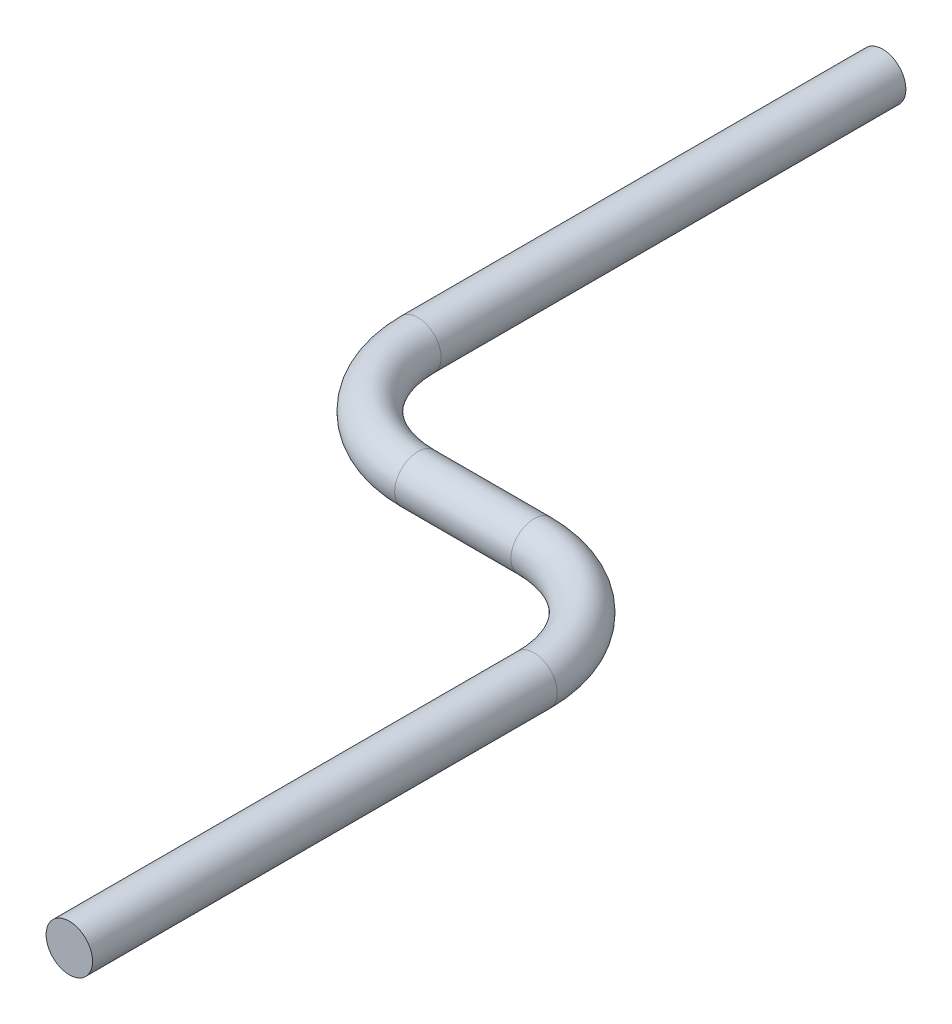
ISO-10303-21;
HEADER;
FILE_DESCRIPTION(('STEP AP214'),'2;1');
FILE_NAME('part.step','',(''),(''),'','','');
FILE_SCHEMA(('AUTOMOTIVE_DESIGN { 1 0 10303 214 1 1 1 1 }'));
ENDSEC;
DATA;
#1=APPLICATION_CONTEXT('core data for automotive mechanical design processes');
#2=APPLICATION_PROTOCOL_DEFINITION('international standard','automotive_design',2000,#1);
#3=PRODUCT_CONTEXT('',#1,'mechanical');
#4=PRODUCT('Part','Part','',(#3));
#5=PRODUCT_RELATED_PRODUCT_CATEGORY('part','',(#4));
#6=PRODUCT_DEFINITION_FORMATION('','',#4);
#7=PRODUCT_DEFINITION_CONTEXT('part definition',#1,'design');
#8=PRODUCT_DEFINITION('design','',#6,#7);
#9=PRODUCT_DEFINITION_SHAPE('','',#8);
#10=(LENGTH_UNIT() NAMED_UNIT(*) SI_UNIT(.MILLI.,.METRE.));
#11=(NAMED_UNIT(*) PLANE_ANGLE_UNIT() SI_UNIT($,.RADIAN.));
#12=(NAMED_UNIT(*) SI_UNIT($,.STERADIAN.) SOLID_ANGLE_UNIT());
#13=UNCERTAINTY_MEASURE_WITH_UNIT(LENGTH_MEASURE(1.E-05),#10,'distance_accuracy_value','');
#14=(GEOMETRIC_REPRESENTATION_CONTEXT(3) GLOBAL_UNCERTAINTY_ASSIGNED_CONTEXT((#13)) GLOBAL_UNIT_ASSIGNED_CONTEXT((#10,
#11,#12)) REPRESENTATION_CONTEXT('',''));
#15=CARTESIAN_POINT('',(0.,0.,0.));
#16=DIRECTION('',(0.,0.,1.));
#17=DIRECTION('',(1.,0.,0.));
#18=AXIS2_PLACEMENT_3D('',#15,#16,#17);
#19=CARTESIAN_POINT('',(0.,0.,0.));
#20=DIRECTION('',(0.,0.,1.));
#21=DIRECTION('',(1.,0.,0.));
#22=AXIS2_PLACEMENT_3D('',#19,#20,#21);
#23=PLANE('',#22);
#24=CARTESIAN_POINT('',(0.,0.,0.));
#25=DIRECTION('',(0.,0.,1.));
#26=DIRECTION('',(1.,0.,0.));
#27=AXIS2_PLACEMENT_3D('',#24,#25,#26);
#28=CIRCLE('',#27,2.);
#29=CARTESIAN_POINT('',(2.,0.,0.));
#30=VERTEX_POINT('',#29);
#31=EDGE_CURVE('E57',#30,#30,#28,.T.);
#32=ORIENTED_EDGE('',*,*,#31,.F.);
#33=EDGE_LOOP('',(#32));
#34=FACE_BOUND('',#33,.T.);
#35=ADVANCED_FACE('F35',(#34),#23,.F.);
#36=CARTESIAN_POINT('',(30.,0.,100.));
#37=DIRECTION('',(0.,0.,1.));
#38=DIRECTION('',(1.,0.,0.));
#39=AXIS2_PLACEMENT_3D('',#36,#37,#38);
#40=PLANE('',#39);
#41=CARTESIAN_POINT('',(30.,0.,100.));
#42=DIRECTION('',(0.,0.,1.));
#43=DIRECTION('',(1.,0.,0.));
#44=AXIS2_PLACEMENT_3D('',#41,#42,#43);
#45=CIRCLE('',#44,2.);
#46=CARTESIAN_POINT('',(32.,0.,100.));
#47=VERTEX_POINT('',#46);
#48=EDGE_CURVE('E10',#47,#47,#45,.T.);
#49=ORIENTED_EDGE('',*,*,#48,.T.);
#50=EDGE_LOOP('',(#49));
#51=FACE_BOUND('',#50,.T.);
#52=ADVANCED_FACE('F64',(#51),#40,.T.);
#53=CARTESIAN_POINT('',(0.,0.,0.));
#54=DIRECTION('',(0.,0.,1.));
#55=DIRECTION('',(1.,0.,0.));
#56=AXIS2_PLACEMENT_3D('',#53,#54,#55);
#57=CYLINDRICAL_SURFACE('',#56,2.);
#58=CARTESIAN_POINT('',(0.,0.,39.9999999999999));
#59=DIRECTION('',(0.,0.,1.));
#60=DIRECTION('',(1.,0.,0.));
#61=AXIS2_PLACEMENT_3D('',#58,#59,#60);
#62=CIRCLE('',#61,2.);
#63=CARTESIAN_POINT('',(-2.,0.,39.9999999999999));
#64=VERTEX_POINT('',#63);
#65=EDGE_CURVE('E54',#64,#64,#62,.T.);
#66=ORIENTED_EDGE('',*,*,#65,.F.);
#67=EDGE_LOOP('',(#66));
#68=FACE_BOUND('',#67,.T.);
#69=ORIENTED_EDGE('',*,*,#31,.T.);
#70=EDGE_LOOP('',(#69));
#71=FACE_BOUND('',#70,.T.);
#72=ADVANCED_FACE('F61',(#68,#71),#57,.T.);
#73=CARTESIAN_POINT('',(10.,0.,40.));
#74=DIRECTION('',(0.,1.,0.));
#75=DIRECTION('',(0.,0.,1.));
#76=AXIS2_PLACEMENT_3D('',#73,#74,#75);
#77=TOROIDAL_SURFACE('',#76,10.,2.);
#78=CARTESIAN_POINT('',(10.,0.,50.));
#79=DIRECTION('',(1.,0.,0.));
#80=DIRECTION('',(0.,0.,-1.));
#81=AXIS2_PLACEMENT_3D('',#78,#79,#80);
#82=CIRCLE('',#81,2.);
#83=CARTESIAN_POINT('',(10.,0.,52.));
#84=VERTEX_POINT('',#83);
#85=EDGE_CURVE('E49',#84,#84,#82,.T.);
#86=CARTESIAN_POINT('',(10.,0.,40.));
#87=DIRECTION('',(0.,1.,0.));
#88=DIRECTION('',(0.,0.,1.));
#89=AXIS2_PLACEMENT_3D('',#86,#87,#88);
#90=CIRCLE('',#89,12.);
#91=EDGE_CURVE('',#64,#84,#90,.T.);
#92=ORIENTED_EDGE('',*,*,#65,.T.);
#93=ORIENTED_EDGE('',*,*,#85,.F.);
#94=ORIENTED_EDGE('',*,*,#91,.T.);
#95=ORIENTED_EDGE('',*,*,#91,.F.);
#96=EDGE_LOOP('',(#92,#94,#93,#95));
#97=FACE_BOUND('',#96,.T.);
#98=ADVANCED_FACE('F82',(#97),#77,.T.);
#99=CARTESIAN_POINT('',(10.,0.,50.));
#100=DIRECTION('',(1.,0.,0.));
#101=DIRECTION('',(0.,0.,-1.));
#102=AXIS2_PLACEMENT_3D('',#99,#100,#101);
#103=CYLINDRICAL_SURFACE('',#102,2.);
#104=CARTESIAN_POINT('',(19.9999999999999,0.,50.));
#105=DIRECTION('',(1.,0.,0.));
#106=DIRECTION('',(0.,0.,-1.));
#107=AXIS2_PLACEMENT_3D('',#104,#105,#106);
#108=CIRCLE('',#107,2.);
#109=CARTESIAN_POINT('',(19.9999999999999,0.,48.));
#110=VERTEX_POINT('',#109);
#111=EDGE_CURVE('E45',#110,#110,#108,.T.);
#112=ORIENTED_EDGE('',*,*,#111,.F.);
#113=EDGE_LOOP('',(#112));
#114=FACE_BOUND('',#113,.T.);
#115=ORIENTED_EDGE('',*,*,#85,.T.);
#116=EDGE_LOOP('',(#115));
#117=FACE_BOUND('',#116,.T.);
#118=ADVANCED_FACE('F76',(#114,#117),#103,.T.);
#119=CARTESIAN_POINT('',(20.,0.,60.));
#120=DIRECTION('',(0.,-1.,0.));
#121=DIRECTION('',(0.,0.,-1.));
#122=AXIS2_PLACEMENT_3D('',#119,#120,#121);
#123=TOROIDAL_SURFACE('',#122,10.,2.);
#124=CARTESIAN_POINT('',(30.,0.,60.0000000000001));
#125=DIRECTION('',(0.,0.,1.));
#126=DIRECTION('',(1.,0.,0.));
#127=AXIS2_PLACEMENT_3D('',#124,#125,#126);
#128=CIRCLE('',#127,2.);
#129=CARTESIAN_POINT('',(32.,0.,60.0000000000001));
#130=VERTEX_POINT('',#129);
#131=EDGE_CURVE('E41',#130,#130,#128,.T.);
#132=CARTESIAN_POINT('',(20.,0.,60.));
#133=DIRECTION('',(0.,-1.,0.));
#134=DIRECTION('',(0.,0.,-1.));
#135=AXIS2_PLACEMENT_3D('',#132,#133,#134);
#136=CIRCLE('',#135,12.);
#137=EDGE_CURVE('',#110,#130,#136,.T.);
#138=ORIENTED_EDGE('',*,*,#111,.T.);
#139=ORIENTED_EDGE('',*,*,#131,.F.);
#140=ORIENTED_EDGE('',*,*,#137,.T.);
#141=ORIENTED_EDGE('',*,*,#137,.F.);
#142=EDGE_LOOP('',(#138,#140,#139,#141));
#143=FACE_BOUND('',#142,.T.);
#144=ADVANCED_FACE('F70',(#143),#123,.T.);
#145=CARTESIAN_POINT('',(30.,0.,60.0000000000001));
#146=DIRECTION('',(0.,0.,1.));
#147=DIRECTION('',(1.,0.,0.));
#148=AXIS2_PLACEMENT_3D('',#145,#146,#147);
#149=CYLINDRICAL_SURFACE('',#148,2.);
#150=ORIENTED_EDGE('',*,*,#48,.F.);
#151=EDGE_LOOP('',(#150));
#152=FACE_BOUND('',#151,.T.);
#153=ORIENTED_EDGE('',*,*,#131,.T.);
#154=EDGE_LOOP('',(#153));
#155=FACE_BOUND('',#154,.T.);
#156=ADVANCED_FACE('F68',(#152,#155),#149,.T.);
#157=CLOSED_SHELL('',(#35,#52,#72,#98,#118,#144,#156));
#158=MANIFOLD_SOLID_BREP('B2',#157);
#159=ADVANCED_BREP_SHAPE_REPRESENTATION('',(#18,#158),#14);
#160=SHAPE_DEFINITION_REPRESENTATION(#9,#159);
ENDSEC;
END-ISO-10303-21;
